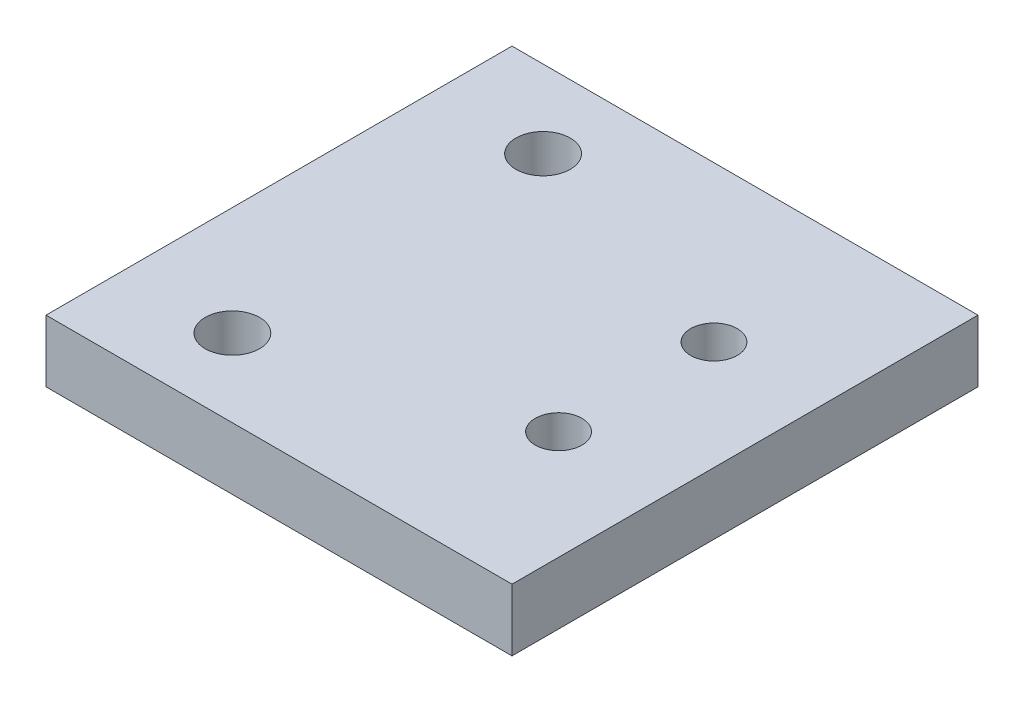
ISO-10303-21;
HEADER;
FILE_DESCRIPTION(('STEP AP214'),'2;1');
FILE_NAME('part.step','',(''),(''),'','','');
FILE_SCHEMA(('AUTOMOTIVE_DESIGN { 1 0 10303 214 1 1 1 1 }'));
ENDSEC;
DATA;
#1=APPLICATION_CONTEXT('core data for automotive mechanical design processes');
#2=APPLICATION_PROTOCOL_DEFINITION('international standard','automotive_design',2000,#1);
#3=PRODUCT_CONTEXT('',#1,'mechanical');
#4=PRODUCT('Part','Part','',(#3));
#5=PRODUCT_RELATED_PRODUCT_CATEGORY('part','',(#4));
#6=PRODUCT_DEFINITION_FORMATION('','',#4);
#7=PRODUCT_DEFINITION_CONTEXT('part definition',#1,'design');
#8=PRODUCT_DEFINITION('design','',#6,#7);
#9=PRODUCT_DEFINITION_SHAPE('','',#8);
#10=(LENGTH_UNIT() NAMED_UNIT(*) SI_UNIT(.MILLI.,.METRE.));
#11=(NAMED_UNIT(*) PLANE_ANGLE_UNIT() SI_UNIT($,.RADIAN.));
#12=(NAMED_UNIT(*) SI_UNIT($,.STERADIAN.) SOLID_ANGLE_UNIT());
#13=UNCERTAINTY_MEASURE_WITH_UNIT(LENGTH_MEASURE(1.E-05),#10,'distance_accuracy_value','');
#14=(GEOMETRIC_REPRESENTATION_CONTEXT(3) GLOBAL_UNCERTAINTY_ASSIGNED_CONTEXT((#13)) GLOBAL_UNIT_ASSIGNED_CONTEXT((#10,
#11,#12)) REPRESENTATION_CONTEXT('',''));
#15=CARTESIAN_POINT('',(0.,0.,0.));
#16=DIRECTION('',(0.,0.,1.));
#17=DIRECTION('',(1.,0.,0.));
#18=AXIS2_PLACEMENT_3D('',#15,#16,#17);
#19=CARTESIAN_POINT('',(0.,4.,0.));
#20=DIRECTION('',(0.,-1.,0.));
#21=DIRECTION('',(0.,0.,-1.));
#22=AXIS2_PLACEMENT_3D('',#19,#20,#21);
#23=PLANE('',#22);
#24=CARTESIAN_POINT('',(23.,4.,-20.));
#25=DIRECTION('',(0.,1.,0.));
#26=DIRECTION('',(0.,0.,1.));
#27=AXIS2_PLACEMENT_3D('',#24,#25,#26);
#28=CIRCLE('',#27,1.5);
#29=CARTESIAN_POINT('',(23.,4.,-18.5));
#30=VERTEX_POINT('',#29);
#31=EDGE_CURVE('E123',#30,#30,#28,.T.);
#32=ORIENTED_EDGE('',*,*,#31,.F.);
#33=EDGE_LOOP('',(#32));
#34=FACE_BOUND('',#33,.T.);
#35=CARTESIAN_POINT('',(7.,4.,-25.));
#36=DIRECTION('',(0.,1.,0.));
#37=DIRECTION('',(0.,0.,1.));
#38=AXIS2_PLACEMENT_3D('',#35,#36,#37);
#39=CIRCLE('',#38,1.75);
#40=CARTESIAN_POINT('',(7.,4.,-23.25));
#41=VERTEX_POINT('',#40);
#42=EDGE_CURVE('E102',#41,#41,#39,.T.);
#43=ORIENTED_EDGE('',*,*,#42,.F.);
#44=EDGE_LOOP('',(#43));
#45=FACE_BOUND('',#44,.T.);
#46=DIRECTION('',(1.,0.,0.));
#47=VECTOR('',#46,1.);
#48=CARTESIAN_POINT('',(30.,4.,0.));
#49=LINE('',#48,#47);
#50=CARTESIAN_POINT('',(0.,4.,0.));
#51=VERTEX_POINT('',#50);
#52=CARTESIAN_POINT('',(30.,4.,0.));
#53=VERTEX_POINT('',#52);
#54=EDGE_CURVE('E87',#51,#53,#49,.T.);
#55=ORIENTED_EDGE('',*,*,#54,.T.);
#56=DIRECTION('',(0.,0.,-1.));
#57=VECTOR('',#56,1.);
#58=CARTESIAN_POINT('',(30.,4.,-30.));
#59=LINE('',#58,#57);
#60=CARTESIAN_POINT('',(30.,4.,-30.));
#61=VERTEX_POINT('',#60);
#62=EDGE_CURVE('E82',#53,#61,#59,.T.);
#63=ORIENTED_EDGE('',*,*,#62,.T.);
#64=DIRECTION('',(-1.,0.,0.));
#65=VECTOR('',#64,1.);
#66=CARTESIAN_POINT('',(0.,4.,-30.));
#67=LINE('',#66,#65);
#68=CARTESIAN_POINT('',(0.,4.,-30.));
#69=VERTEX_POINT('',#68);
#70=EDGE_CURVE('E85',#61,#69,#67,.T.);
#71=ORIENTED_EDGE('',*,*,#70,.T.);
#72=DIRECTION('',(0.,0.,1.));
#73=VECTOR('',#72,1.);
#74=CARTESIAN_POINT('',(0.,4.,0.));
#75=LINE('',#74,#73);
#76=EDGE_CURVE('E52',#69,#51,#75,.T.);
#77=ORIENTED_EDGE('',*,*,#76,.T.);
#78=EDGE_LOOP('',(#55,#63,#71,#77));
#79=FACE_BOUND('',#78,.T.);
#80=CARTESIAN_POINT('',(7.,4.,-5.));
#81=DIRECTION('',(0.,1.,0.));
#82=DIRECTION('',(0.,0.,1.));
#83=AXIS2_PLACEMENT_3D('',#80,#81,#82);
#84=CIRCLE('',#83,1.75);
#85=CARTESIAN_POINT('',(7.,4.,-3.25));
#86=VERTEX_POINT('',#85);
#87=EDGE_CURVE('E117',#86,#86,#84,.T.);
#88=ORIENTED_EDGE('',*,*,#87,.F.);
#89=EDGE_LOOP('',(#88));
#90=FACE_BOUND('',#89,.T.);
#91=CARTESIAN_POINT('',(23.,4.,-10.));
#92=DIRECTION('',(0.,1.,0.));
#93=DIRECTION('',(0.,0.,1.));
#94=AXIS2_PLACEMENT_3D('',#91,#92,#93);
#95=CIRCLE('',#94,1.5);
#96=CARTESIAN_POINT('',(23.,4.,-8.5));
#97=VERTEX_POINT('',#96);
#98=EDGE_CURVE('E129',#97,#97,#95,.T.);
#99=ORIENTED_EDGE('',*,*,#98,.F.);
#100=EDGE_LOOP('',(#99));
#101=FACE_BOUND('',#100,.T.);
#102=ADVANCED_FACE('F35',(#34,#45,#79,#90,#101),#23,.F.);
#103=CARTESIAN_POINT('',(0.,0.,0.));
#104=DIRECTION('',(0.,-1.,0.));
#105=DIRECTION('',(0.,0.,-1.));
#106=AXIS2_PLACEMENT_3D('',#103,#104,#105);
#107=PLANE('',#106);
#108=CARTESIAN_POINT('',(23.,0.,-20.));
#109=DIRECTION('',(0.,1.,0.));
#110=DIRECTION('',(0.,0.,1.));
#111=AXIS2_PLACEMENT_3D('',#108,#109,#110);
#112=CIRCLE('',#111,1.5);
#113=CARTESIAN_POINT('',(23.,0.,-18.5));
#114=VERTEX_POINT('',#113);
#115=EDGE_CURVE('E126',#114,#114,#112,.T.);
#116=ORIENTED_EDGE('',*,*,#115,.T.);
#117=EDGE_LOOP('',(#116));
#118=FACE_BOUND('',#117,.T.);
#119=CARTESIAN_POINT('',(7.,0.,-25.));
#120=DIRECTION('',(0.,1.,0.));
#121=DIRECTION('',(0.,0.,1.));
#122=AXIS2_PLACEMENT_3D('',#119,#120,#121);
#123=CIRCLE('',#122,1.75);
#124=CARTESIAN_POINT('',(7.,0.,-23.25));
#125=VERTEX_POINT('',#124);
#126=EDGE_CURVE('E114',#125,#125,#123,.T.);
#127=ORIENTED_EDGE('',*,*,#126,.T.);
#128=EDGE_LOOP('',(#127));
#129=FACE_BOUND('',#128,.T.);
#130=DIRECTION('',(1.,0.,0.));
#131=VECTOR('',#130,1.);
#132=CARTESIAN_POINT('',(30.,0.,0.));
#133=LINE('',#132,#131);
#134=CARTESIAN_POINT('',(0.,0.,0.));
#135=VERTEX_POINT('',#134);
#136=CARTESIAN_POINT('',(30.,0.,0.));
#137=VERTEX_POINT('',#136);
#138=EDGE_CURVE('E99',#135,#137,#133,.T.);
#139=ORIENTED_EDGE('',*,*,#138,.F.);
#140=DIRECTION('',(0.,0.,1.));
#141=VECTOR('',#140,1.);
#142=CARTESIAN_POINT('',(0.,0.,0.));
#143=LINE('',#142,#141);
#144=CARTESIAN_POINT('',(0.,0.,-30.));
#145=VERTEX_POINT('',#144);
#146=EDGE_CURVE('E75',#145,#135,#143,.T.);
#147=ORIENTED_EDGE('',*,*,#146,.F.);
#148=DIRECTION('',(-1.,0.,0.));
#149=VECTOR('',#148,1.);
#150=CARTESIAN_POINT('',(0.,0.,-30.));
#151=LINE('',#150,#149);
#152=CARTESIAN_POINT('',(30.,0.,-30.));
#153=VERTEX_POINT('',#152);
#154=EDGE_CURVE('E69',#153,#145,#151,.T.);
#155=ORIENTED_EDGE('',*,*,#154,.F.);
#156=DIRECTION('',(0.,0.,-1.));
#157=VECTOR('',#156,1.);
#158=CARTESIAN_POINT('',(30.,0.,-30.));
#159=LINE('',#158,#157);
#160=EDGE_CURVE('E91',#137,#153,#159,.T.);
#161=ORIENTED_EDGE('',*,*,#160,.F.);
#162=EDGE_LOOP('',(#139,#147,#155,#161));
#163=FACE_BOUND('',#162,.T.);
#164=CARTESIAN_POINT('',(7.,0.,-5.));
#165=DIRECTION('',(0.,1.,0.));
#166=DIRECTION('',(0.,0.,1.));
#167=AXIS2_PLACEMENT_3D('',#164,#165,#166);
#168=CIRCLE('',#167,1.75);
#169=CARTESIAN_POINT('',(7.,0.,-3.25));
#170=VERTEX_POINT('',#169);
#171=EDGE_CURVE('E120',#170,#170,#168,.T.);
#172=ORIENTED_EDGE('',*,*,#171,.T.);
#173=EDGE_LOOP('',(#172));
#174=FACE_BOUND('',#173,.T.);
#175=CARTESIAN_POINT('',(23.,0.,-10.));
#176=DIRECTION('',(0.,1.,0.));
#177=DIRECTION('',(0.,0.,1.));
#178=AXIS2_PLACEMENT_3D('',#175,#176,#177);
#179=CIRCLE('',#178,1.5);
#180=CARTESIAN_POINT('',(23.,0.,-8.5));
#181=VERTEX_POINT('',#180);
#182=EDGE_CURVE('E132',#181,#181,#179,.T.);
#183=ORIENTED_EDGE('',*,*,#182,.T.);
#184=EDGE_LOOP('',(#183));
#185=FACE_BOUND('',#184,.T.);
#186=ADVANCED_FACE('F110',(#118,#129,#163,#174,#185),#107,.T.);
#187=CARTESIAN_POINT('',(30.,4.,0.));
#188=DIRECTION('',(0.,0.,-1.));
#189=DIRECTION('',(-1.,0.,0.));
#190=AXIS2_PLACEMENT_3D('',#187,#188,#189);
#191=PLANE('',#190);
#192=ORIENTED_EDGE('',*,*,#138,.T.);
#193=DIRECTION('',(0.,-1.,0.));
#194=VECTOR('',#193,1.);
#195=CARTESIAN_POINT('',(30.,4.,0.));
#196=LINE('',#195,#194);
#197=EDGE_CURVE('E11',#53,#137,#196,.T.);
#198=ORIENTED_EDGE('',*,*,#197,.F.);
#199=ORIENTED_EDGE('',*,*,#54,.F.);
#200=DIRECTION('',(0.,-1.,0.));
#201=VECTOR('',#200,1.);
#202=CARTESIAN_POINT('',(0.,4.,0.));
#203=LINE('',#202,#201);
#204=EDGE_CURVE('E95',#51,#135,#203,.T.);
#205=ORIENTED_EDGE('',*,*,#204,.T.);
#206=EDGE_LOOP('',(#192,#198,#199,#205));
#207=FACE_BOUND('',#206,.T.);
#208=ADVANCED_FACE('F37',(#207),#191,.F.);
#209=CARTESIAN_POINT('',(30.,4.,-30.));
#210=DIRECTION('',(-1.,0.,0.));
#211=DIRECTION('',(0.,0.,1.));
#212=AXIS2_PLACEMENT_3D('',#209,#210,#211);
#213=PLANE('',#212);
#214=ORIENTED_EDGE('',*,*,#160,.T.);
#215=DIRECTION('',(0.,-1.,0.));
#216=VECTOR('',#215,1.);
#217=CARTESIAN_POINT('',(30.,4.,-30.));
#218=LINE('',#217,#216);
#219=EDGE_CURVE('E44',#61,#153,#218,.T.);
#220=ORIENTED_EDGE('',*,*,#219,.F.);
#221=ORIENTED_EDGE('',*,*,#62,.F.);
#222=ORIENTED_EDGE('',*,*,#197,.T.);
#223=EDGE_LOOP('',(#214,#220,#221,#222));
#224=FACE_BOUND('',#223,.T.);
#225=ADVANCED_FACE('F90',(#224),#213,.F.);
#226=CARTESIAN_POINT('',(0.,4.,-30.));
#227=DIRECTION('',(0.,0.,1.));
#228=DIRECTION('',(1.,0.,0.));
#229=AXIS2_PLACEMENT_3D('',#226,#227,#228);
#230=PLANE('',#229);
#231=ORIENTED_EDGE('',*,*,#154,.T.);
#232=DIRECTION('',(0.,-1.,0.));
#233=VECTOR('',#232,1.);
#234=CARTESIAN_POINT('',(0.,4.,-30.));
#235=LINE('',#234,#233);
#236=EDGE_CURVE('E92',#69,#145,#235,.T.);
#237=ORIENTED_EDGE('',*,*,#236,.F.);
#238=ORIENTED_EDGE('',*,*,#70,.F.);
#239=ORIENTED_EDGE('',*,*,#219,.T.);
#240=EDGE_LOOP('',(#231,#237,#238,#239));
#241=FACE_BOUND('',#240,.T.);
#242=ADVANCED_FACE('F93',(#241),#230,.F.);
#243=CARTESIAN_POINT('',(0.,4.,0.));
#244=DIRECTION('',(1.,0.,0.));
#245=DIRECTION('',(0.,0.,-1.));
#246=AXIS2_PLACEMENT_3D('',#243,#244,#245);
#247=PLANE('',#246);
#248=ORIENTED_EDGE('',*,*,#146,.T.);
#249=ORIENTED_EDGE('',*,*,#204,.F.);
#250=ORIENTED_EDGE('',*,*,#76,.F.);
#251=ORIENTED_EDGE('',*,*,#236,.T.);
#252=EDGE_LOOP('',(#248,#249,#250,#251));
#253=FACE_BOUND('',#252,.T.);
#254=ADVANCED_FACE('F107',(#253),#247,.F.);
#255=CARTESIAN_POINT('',(7.,4.,-25.));
#256=DIRECTION('',(0.,-1.,0.));
#257=DIRECTION('',(0.,0.,-1.));
#258=AXIS2_PLACEMENT_3D('',#255,#256,#257);
#259=CYLINDRICAL_SURFACE('',#258,1.75);
#260=ORIENTED_EDGE('',*,*,#42,.T.);
#261=EDGE_LOOP('',(#260));
#262=FACE_BOUND('',#261,.T.);
#263=ORIENTED_EDGE('',*,*,#126,.F.);
#264=EDGE_LOOP('',(#263));
#265=FACE_BOUND('',#264,.T.);
#266=ADVANCED_FACE('F152',(#262,#265),#259,.F.);
#267=CARTESIAN_POINT('',(7.,4.,-5.));
#268=DIRECTION('',(0.,-1.,0.));
#269=DIRECTION('',(0.,0.,-1.));
#270=AXIS2_PLACEMENT_3D('',#267,#268,#269);
#271=CYLINDRICAL_SURFACE('',#270,1.75);
#272=ORIENTED_EDGE('',*,*,#87,.T.);
#273=EDGE_LOOP('',(#272));
#274=FACE_BOUND('',#273,.T.);
#275=ORIENTED_EDGE('',*,*,#171,.F.);
#276=EDGE_LOOP('',(#275));
#277=FACE_BOUND('',#276,.T.);
#278=ADVANCED_FACE('F198',(#274,#277),#271,.F.);
#279=CARTESIAN_POINT('',(23.,4.,-20.));
#280=DIRECTION('',(0.,-1.,0.));
#281=DIRECTION('',(0.,0.,-1.));
#282=AXIS2_PLACEMENT_3D('',#279,#280,#281);
#283=CYLINDRICAL_SURFACE('',#282,1.5);
#284=ORIENTED_EDGE('',*,*,#31,.T.);
#285=EDGE_LOOP('',(#284));
#286=FACE_BOUND('',#285,.T.);
#287=ORIENTED_EDGE('',*,*,#115,.F.);
#288=EDGE_LOOP('',(#287));
#289=FACE_BOUND('',#288,.T.);
#290=ADVANCED_FACE('F206',(#286,#289),#283,.F.);
#291=CARTESIAN_POINT('',(23.,4.,-10.));
#292=DIRECTION('',(0.,-1.,0.));
#293=DIRECTION('',(0.,0.,-1.));
#294=AXIS2_PLACEMENT_3D('',#291,#292,#293);
#295=CYLINDRICAL_SURFACE('',#294,1.5);
#296=ORIENTED_EDGE('',*,*,#98,.T.);
#297=EDGE_LOOP('',(#296));
#298=FACE_BOUND('',#297,.T.);
#299=ORIENTED_EDGE('',*,*,#182,.F.);
#300=EDGE_LOOP('',(#299));
#301=FACE_BOUND('',#300,.T.);
#302=ADVANCED_FACE('F138',(#298,#301),#295,.F.);
#303=CLOSED_SHELL('',(#102,#186,#208,#225,#242,#254,#266,#278,#290,#302));
#304=MANIFOLD_SOLID_BREP('B2',#303);
#305=ADVANCED_BREP_SHAPE_REPRESENTATION('',(#18,#304),#14);
#306=SHAPE_DEFINITION_REPRESENTATION(#9,#305);
ENDSEC;
END-ISO-10303-21;
